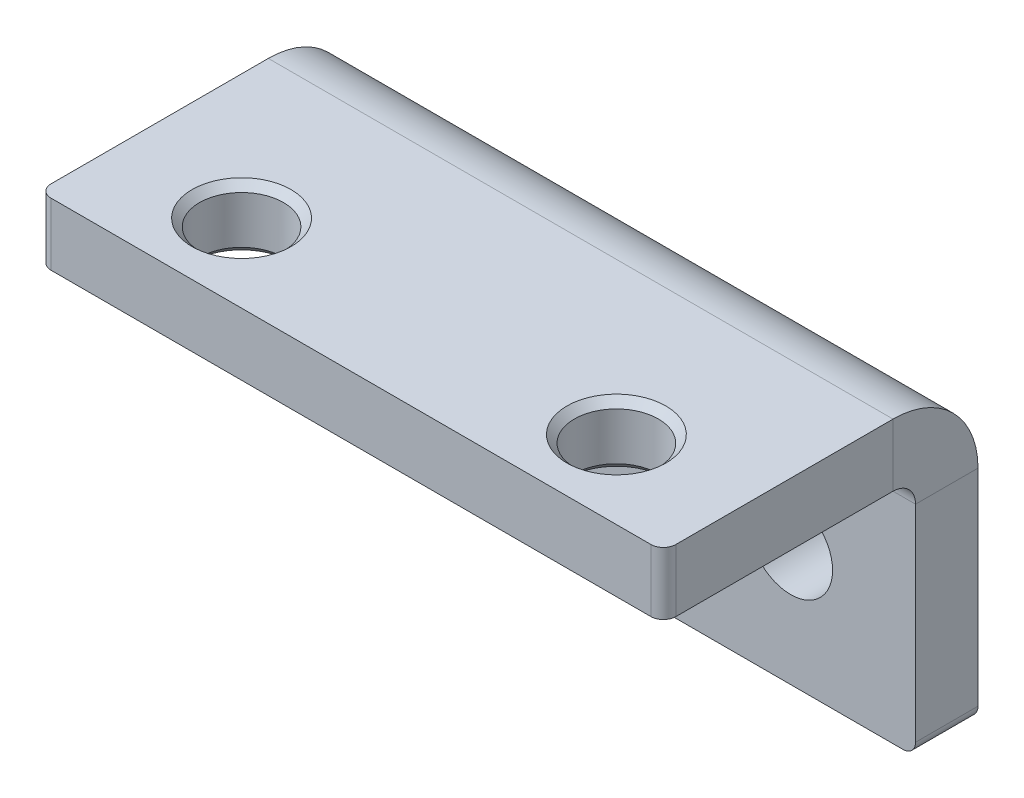
ISO-10303-21;
HEADER;
FILE_DESCRIPTION(('STEP AP214'),'2;1');
FILE_NAME('part.step','',(''),(''),'','','');
FILE_SCHEMA(('AUTOMOTIVE_DESIGN { 1 0 10303 214 1 1 1 1 }'));
ENDSEC;
DATA;
#1=APPLICATION_CONTEXT('core data for automotive mechanical design processes');
#2=APPLICATION_PROTOCOL_DEFINITION('international standard','automotive_design',2000,#1);
#3=PRODUCT_CONTEXT('',#1,'mechanical');
#4=PRODUCT('Part','Part','',(#3));
#5=PRODUCT_RELATED_PRODUCT_CATEGORY('part','',(#4));
#6=PRODUCT_DEFINITION_FORMATION('','',#4);
#7=PRODUCT_DEFINITION_CONTEXT('part definition',#1,'design');
#8=PRODUCT_DEFINITION('design','',#6,#7);
#9=PRODUCT_DEFINITION_SHAPE('','',#8);
#10=(LENGTH_UNIT() NAMED_UNIT(*) SI_UNIT(.MILLI.,.METRE.));
#11=(NAMED_UNIT(*) PLANE_ANGLE_UNIT() SI_UNIT($,.RADIAN.));
#12=(NAMED_UNIT(*) SI_UNIT($,.STERADIAN.) SOLID_ANGLE_UNIT());
#13=UNCERTAINTY_MEASURE_WITH_UNIT(LENGTH_MEASURE(1.E-05),#10,'distance_accuracy_value','');
#14=(GEOMETRIC_REPRESENTATION_CONTEXT(3) GLOBAL_UNCERTAINTY_ASSIGNED_CONTEXT((#13)) GLOBAL_UNIT_ASSIGNED_CONTEXT((#10,
#11,#12)) REPRESENTATION_CONTEXT('',''));
#15=CARTESIAN_POINT('',(0.,0.,0.));
#16=DIRECTION('',(0.,0.,1.));
#17=DIRECTION('',(1.,0.,0.));
#18=AXIS2_PLACEMENT_3D('',#15,#16,#17);
#19=CARTESIAN_POINT('',(15.875,6.16034309821897,15.990143098219));
#20=DIRECTION('',(-1.,0.,0.));
#21=DIRECTION('',(0.,0.,-1.));
#22=AXIS2_PLACEMENT_3D('',#19,#20,#21);
#23=PLANE('',#22);
#24=DIRECTION('',(0.,0.,1.));
#25=VECTOR('',#24,1.);
#26=CARTESIAN_POINT('',(15.875,9.33534309821897,15.990143098219));
#27=LINE('',#26,#25);
#28=CARTESIAN_POINT('',(15.875,9.33534309821901,4.31800000000001));
#29=VERTEX_POINT('',#28);
#30=CARTESIAN_POINT('',(15.875,9.33534309821897,15.355143098219));
#31=VERTEX_POINT('',#30);
#32=EDGE_CURVE('E236',#29,#31,#27,.T.);
#33=ORIENTED_EDGE('',*,*,#32,.T.);
#34=DIRECTION('',(0.,1.,0.));
#35=VECTOR('',#34,1.);
#36=CARTESIAN_POINT('',(15.875,6.16034309821897,15.355143098219));
#37=LINE('',#36,#35);
#38=CARTESIAN_POINT('',(15.875,6.16034309821897,15.355143098219));
#39=VERTEX_POINT('',#38);
#40=EDGE_CURVE('E286',#31,#39,#37,.F.);
#41=ORIENTED_EDGE('',*,*,#40,.T.);
#42=DIRECTION('',(0.,0.,1.));
#43=VECTOR('',#42,1.);
#44=CARTESIAN_POINT('',(15.875,6.16034309821897,15.990143098219));
#45=LINE('',#44,#43);
#46=CARTESIAN_POINT('',(15.875,6.16034309821901,4.318));
#47=VERTEX_POINT('',#46);
#48=EDGE_CURVE('E231',#47,#39,#45,.T.);
#49=ORIENTED_EDGE('',*,*,#48,.F.);
#50=DIRECTION('',(0.,1.,0.));
#51=VECTOR('',#50,1.);
#52=CARTESIAN_POINT('',(15.875,6.16034309821909,4.31799999999999));
#53=LINE('',#52,#51);
#54=EDGE_CURVE('E244',#47,#29,#53,.T.);
#55=ORIENTED_EDGE('',*,*,#54,.T.);
#56=EDGE_LOOP('',(#33,#41,#49,#55));
#57=FACE_BOUND('',#56,.T.);
#58=ADVANCED_FACE('F72',(#57),#23,.F.);
#59=CARTESIAN_POINT('',(-15.875,6.16034309821897,15.990143098219));
#60=DIRECTION('',(1.,0.,0.));
#61=DIRECTION('',(0.,0.,1.));
#62=AXIS2_PLACEMENT_3D('',#59,#60,#61);
#63=PLANE('',#62);
#64=DIRECTION('',(0.,0.,-1.));
#65=VECTOR('',#64,1.);
#66=CARTESIAN_POINT('',(-15.875,6.16034309821897,15.990143098219));
#67=LINE('',#66,#65);
#68=CARTESIAN_POINT('',(-15.875,6.16034309821897,15.355143098219));
#69=VERTEX_POINT('',#68);
#70=CARTESIAN_POINT('',(-15.875,6.160343098219,4.318));
#71=VERTEX_POINT('',#70);
#72=EDGE_CURVE('E235',#69,#71,#67,.T.);
#73=ORIENTED_EDGE('',*,*,#72,.F.);
#74=DIRECTION('',(0.,1.,0.));
#75=VECTOR('',#74,1.);
#76=CARTESIAN_POINT('',(-15.875,6.16034309821897,15.355143098219));
#77=LINE('',#76,#75);
#78=CARTESIAN_POINT('',(-15.875,9.33534309821897,15.355143098219));
#79=VERTEX_POINT('',#78);
#80=EDGE_CURVE('E12',#69,#79,#77,.T.);
#81=ORIENTED_EDGE('',*,*,#80,.T.);
#82=DIRECTION('',(0.,0.,-1.));
#83=VECTOR('',#82,1.);
#84=CARTESIAN_POINT('',(-15.875,9.33534309821897,15.990143098219));
#85=LINE('',#84,#83);
#86=CARTESIAN_POINT('',(-15.875,9.33534309821901,4.31800000000001));
#87=VERTEX_POINT('',#86);
#88=EDGE_CURVE('E209',#79,#87,#85,.T.);
#89=ORIENTED_EDGE('',*,*,#88,.T.);
#90=DIRECTION('',(0.,-1.,0.));
#91=VECTOR('',#90,1.);
#92=CARTESIAN_POINT('',(-15.875,6.16034309821909,4.31799999999999));
#93=LINE('',#92,#91);
#94=EDGE_CURVE('E238',#87,#71,#93,.T.);
#95=ORIENTED_EDGE('',*,*,#94,.T.);
#96=EDGE_LOOP('',(#73,#81,#89,#95));
#97=FACE_BOUND('',#96,.T.);
#98=ADVANCED_FACE('F335',(#97),#63,.F.);
#99=CARTESIAN_POINT('',(0.,9.33534309821904,-4.888656901781));
#100=DIRECTION('',(0.,-1.,0.));
#101=DIRECTION('',(1.,0.,0.));
#102=AXIS2_PLACEMENT_3D('',#99,#100,#101);
#103=PLANE('',#102);
#104=CARTESIAN_POINT('',(9.525,9.33534309821898,12.027743098219));
#105=DIRECTION('',(0.,-1.,0.));
#106=DIRECTION('',(0.,0.,-1.));
#107=AXIS2_PLACEMENT_3D('',#104,#105,#106);
#108=CIRCLE('',#107,2.51459999999999);
#109=CARTESIAN_POINT('',(9.525,9.33534309821899,9.51314309821901));
#110=VERTEX_POINT('',#109);
#111=EDGE_CURVE('E256',#110,#110,#108,.T.);
#112=ORIENTED_EDGE('',*,*,#111,.T.);
#113=EDGE_LOOP('',(#112));
#114=FACE_BOUND('',#113,.T.);
#115=CARTESIAN_POINT('',(-9.525,9.33534309821898,12.027743098219));
#116=DIRECTION('',(0.,-1.,0.));
#117=DIRECTION('',(0.,0.,-1.));
#118=AXIS2_PLACEMENT_3D('',#115,#116,#117);
#119=CIRCLE('',#118,2.51459999999999);
#120=CARTESIAN_POINT('',(-9.525,9.33534309821899,9.51314309821901));
#121=VERTEX_POINT('',#120);
#122=EDGE_CURVE('E247',#121,#121,#119,.T.);
#123=ORIENTED_EDGE('',*,*,#122,.T.);
#124=EDGE_LOOP('',(#123));
#125=FACE_BOUND('',#124,.T.);
#126=DIRECTION('',(-1.,0.,0.));
#127=VECTOR('',#126,1.);
#128=CARTESIAN_POINT('',(-15.875,9.33534309821897,15.990143098219));
#129=LINE('',#128,#127);
#130=CARTESIAN_POINT('',(15.24,9.33534309821897,15.990143098219));
#131=VERTEX_POINT('',#130);
#132=CARTESIAN_POINT('',(-15.24,9.33534309821897,15.990143098219));
#133=VERTEX_POINT('',#132);
#134=EDGE_CURVE('E232',#131,#133,#129,.T.);
#135=ORIENTED_EDGE('',*,*,#134,.F.);
#136=CARTESIAN_POINT('',(15.24,9.33534309821897,15.355143098219));
#137=DIRECTION('',(0.,-1.,0.));
#138=DIRECTION('',(0.,0.,-1.));
#139=AXIS2_PLACEMENT_3D('',#136,#137,#138);
#140=CIRCLE('',#139,0.635);
#141=EDGE_CURVE('E284',#131,#31,#140,.F.);
#142=ORIENTED_EDGE('',*,*,#141,.T.);
#143=ORIENTED_EDGE('',*,*,#32,.F.);
#144=DIRECTION('',(-1.,0.,0.));
#145=VECTOR('',#144,1.);
#146=CARTESIAN_POINT('',(0.,9.33534309821901,4.31800000000003));
#147=LINE('',#146,#145);
#148=EDGE_CURVE('E241',#29,#87,#147,.T.);
#149=ORIENTED_EDGE('',*,*,#148,.T.);
#150=ORIENTED_EDGE('',*,*,#88,.F.);
#151=CARTESIAN_POINT('',(-15.24,9.33534309821897,15.355143098219));
#152=DIRECTION('',(0.,-1.,0.));
#153=DIRECTION('',(0.,0.,-1.));
#154=AXIS2_PLACEMENT_3D('',#151,#152,#153);
#155=CIRCLE('',#154,0.635);
#156=EDGE_CURVE('E282',#79,#133,#155,.F.);
#157=ORIENTED_EDGE('',*,*,#156,.T.);
#158=EDGE_LOOP('',(#135,#142,#143,#149,#150,#157));
#159=FACE_BOUND('',#158,.T.);
#160=ADVANCED_FACE('F332',(#114,#125,#159),#103,.F.);
#161=CARTESIAN_POINT('',(0.,6.16034309821904,-4.88865690178101));
#162=DIRECTION('',(0.,-1.,0.));
#163=DIRECTION('',(1.,0.,0.));
#164=AXIS2_PLACEMENT_3D('',#161,#162,#163);
#165=PLANE('',#164);
#166=CARTESIAN_POINT('',(9.525,6.16034309821898,12.027743098219));
#167=DIRECTION('',(0.,-1.,0.));
#168=DIRECTION('',(0.,0.,-1.));
#169=AXIS2_PLACEMENT_3D('',#166,#167,#168);
#170=CIRCLE('',#169,2.5146);
#171=CARTESIAN_POINT('',(9.525,6.16034309821899,9.51314309821899));
#172=VERTEX_POINT('',#171);
#173=EDGE_CURVE('E268',#172,#172,#170,.F.);
#174=ORIENTED_EDGE('',*,*,#173,.T.);
#175=EDGE_LOOP('',(#174));
#176=FACE_BOUND('',#175,.T.);
#177=CARTESIAN_POINT('',(-9.525,6.16034309821898,12.027743098219));
#178=DIRECTION('',(0.,-1.,0.));
#179=DIRECTION('',(0.,0.,-1.));
#180=AXIS2_PLACEMENT_3D('',#177,#178,#179);
#181=CIRCLE('',#180,2.5146);
#182=CARTESIAN_POINT('',(-9.525,6.16034309821899,9.51314309821899));
#183=VERTEX_POINT('',#182);
#184=EDGE_CURVE('E265',#183,#183,#181,.F.);
#185=ORIENTED_EDGE('',*,*,#184,.T.);
#186=EDGE_LOOP('',(#185));
#187=FACE_BOUND('',#186,.T.);
#188=ORIENTED_EDGE('',*,*,#48,.T.);
#189=CARTESIAN_POINT('',(15.24,6.16034309821897,15.355143098219));
#190=DIRECTION('',(0.,-1.,0.));
#191=DIRECTION('',(0.,0.,-1.));
#192=AXIS2_PLACEMENT_3D('',#189,#190,#191);
#193=CIRCLE('',#192,0.635);
#194=CARTESIAN_POINT('',(15.24,6.16034309821897,15.990143098219));
#195=VERTEX_POINT('',#194);
#196=EDGE_CURVE('E290',#39,#195,#193,.T.);
#197=ORIENTED_EDGE('',*,*,#196,.T.);
#198=DIRECTION('',(-1.,0.,0.));
#199=VECTOR('',#198,1.);
#200=CARTESIAN_POINT('',(-15.875,6.16034309821897,15.990143098219));
#201=LINE('',#200,#199);
#202=CARTESIAN_POINT('',(-15.24,6.16034309821897,15.990143098219));
#203=VERTEX_POINT('',#202);
#204=EDGE_CURVE('E228',#195,#203,#201,.T.);
#205=ORIENTED_EDGE('',*,*,#204,.T.);
#206=CARTESIAN_POINT('',(-15.24,6.16034309821897,15.355143098219));
#207=DIRECTION('',(0.,-1.,0.));
#208=DIRECTION('',(0.,0.,-1.));
#209=AXIS2_PLACEMENT_3D('',#206,#207,#208);
#210=CIRCLE('',#209,0.635);
#211=EDGE_CURVE('E288',#203,#69,#210,.T.);
#212=ORIENTED_EDGE('',*,*,#211,.T.);
#213=ORIENTED_EDGE('',*,*,#72,.T.);
#214=DIRECTION('',(-1.,0.,0.));
#215=VECTOR('',#214,1.);
#216=CARTESIAN_POINT('',(0.,6.16034309821901,4.31799999999999));
#217=LINE('',#216,#215);
#218=EDGE_CURVE('E195',#47,#71,#217,.T.);
#219=ORIENTED_EDGE('',*,*,#218,.F.);
#220=EDGE_LOOP('',(#188,#197,#205,#212,#213,#219));
#221=FACE_BOUND('',#220,.T.);
#222=ADVANCED_FACE('F351',(#176,#187,#221),#165,.T.);
#223=CARTESIAN_POINT('',(-15.875,6.16034309821897,15.990143098219));
#224=DIRECTION('',(0.,0.,-1.));
#225=DIRECTION('',(0.,1.,0.));
#226=AXIS2_PLACEMENT_3D('',#223,#224,#225);
#227=PLANE('',#226);
#228=ORIENTED_EDGE('',*,*,#204,.F.);
#229=DIRECTION('',(0.,1.,0.));
#230=VECTOR('',#229,1.);
#231=CARTESIAN_POINT('',(15.24,6.16034309821897,15.990143098219));
#232=LINE('',#231,#230);
#233=EDGE_CURVE('E279',#195,#131,#232,.T.);
#234=ORIENTED_EDGE('',*,*,#233,.T.);
#235=ORIENTED_EDGE('',*,*,#134,.T.);
#236=DIRECTION('',(0.,1.,0.));
#237=VECTOR('',#236,1.);
#238=CARTESIAN_POINT('',(-15.24,6.16034309821897,15.990143098219));
#239=LINE('',#238,#237);
#240=EDGE_CURVE('E277',#133,#203,#239,.F.);
#241=ORIENTED_EDGE('',*,*,#240,.T.);
#242=EDGE_LOOP('',(#228,#234,#235,#241));
#243=FACE_BOUND('',#242,.T.);
#244=ADVANCED_FACE('F342',(#243),#227,.F.);
#245=CARTESIAN_POINT('',(9.525,6.16034309821898,12.027743098219));
#246=DIRECTION('',(0.,1.,0.));
#247=DIRECTION('',(-1.,0.,0.));
#248=AXIS2_PLACEMENT_3D('',#245,#246,#247);
#249=CYLINDRICAL_SURFACE('',#248,2.1336);
#250=CARTESIAN_POINT('',(9.525,8.95434309821899,12.027743098219));
#251=DIRECTION('',(0.,-1.,0.));
#252=DIRECTION('',(0.,0.,-1.));
#253=AXIS2_PLACEMENT_3D('',#250,#251,#252);
#254=CIRCLE('',#253,2.1336);
#255=CARTESIAN_POINT('',(7.3914,8.95434309821899,12.027743098219));
#256=VERTEX_POINT('',#255);
#257=EDGE_CURVE('E262',#256,#256,#254,.F.);
#258=CARTESIAN_POINT('',(9.525,6.54134309821898,12.027743098219));
#259=DIRECTION('',(0.,-1.,0.));
#260=DIRECTION('',(0.,0.,-1.));
#261=AXIS2_PLACEMENT_3D('',#258,#259,#260);
#262=CIRCLE('',#261,2.1336);
#263=CARTESIAN_POINT('',(7.3914,6.54134309821898,12.027743098219));
#264=VERTEX_POINT('',#263);
#265=EDGE_CURVE('E259',#264,#264,#262,.T.);
#266=CARTESIAN_POINT('',(7.3914,8.95434309821899,12.027743098219));
#267=CARTESIAN_POINT('',(7.3914,8.92920768155233,12.027743098219));
#268=CARTESIAN_POINT('',(7.3914,8.90407226488566,12.027743098219));
#269=CARTESIAN_POINT('',(7.3914,8.85380143155232,12.027743098219));
#270=CARTESIAN_POINT('',(7.3914,8.82866601488566,12.027743098219));
#271=CARTESIAN_POINT('',(7.3914,8.77839518155232,12.027743098219));
#272=CARTESIAN_POINT('',(7.3914,8.75325976488566,12.027743098219));
#273=CARTESIAN_POINT('',(7.3914,8.70298893155232,12.027743098219));
#274=CARTESIAN_POINT('',(7.3914,8.67785351488566,12.027743098219));
#275=CARTESIAN_POINT('',(7.3914,8.62758268155232,12.027743098219));
#276=CARTESIAN_POINT('',(7.3914,8.60244726488566,12.027743098219));
#277=CARTESIAN_POINT('',(7.3914,8.55217643155232,12.027743098219));
#278=CARTESIAN_POINT('',(7.3914,8.52704101488566,12.027743098219));
#279=CARTESIAN_POINT('',(7.3914,8.47677018155232,12.027743098219));
#280=CARTESIAN_POINT('',(7.3914,8.45163476488566,12.027743098219));
#281=CARTESIAN_POINT('',(7.3914,8.40136393155232,12.027743098219));
#282=CARTESIAN_POINT('',(7.3914,8.37622851488566,12.027743098219));
#283=CARTESIAN_POINT('',(7.3914,8.32595768155232,12.027743098219));
#284=CARTESIAN_POINT('',(7.3914,8.30082226488565,12.027743098219));
#285=CARTESIAN_POINT('',(7.3914,8.25055143155232,12.027743098219));
#286=CARTESIAN_POINT('',(7.3914,8.22541601488565,12.027743098219));
#287=CARTESIAN_POINT('',(7.3914,8.17514518155232,12.027743098219));
#288=CARTESIAN_POINT('',(7.3914,8.15000976488565,12.027743098219));
#289=CARTESIAN_POINT('',(7.3914,8.09973893155232,12.027743098219));
#290=CARTESIAN_POINT('',(7.3914,8.07460351488565,12.027743098219));
#291=CARTESIAN_POINT('',(7.3914,8.02433268155232,12.027743098219));
#292=CARTESIAN_POINT('',(7.3914,7.99919726488565,12.027743098219));
#293=CARTESIAN_POINT('',(7.3914,7.94892643155232,12.027743098219));
#294=CARTESIAN_POINT('',(7.3914,7.92379101488565,12.027743098219));
#295=CARTESIAN_POINT('',(7.3914,7.87352018155232,12.027743098219));
#296=CARTESIAN_POINT('',(7.3914,7.84838476488565,12.027743098219));
#297=CARTESIAN_POINT('',(7.3914,7.79811393155232,12.027743098219));
#298=CARTESIAN_POINT('',(7.3914,7.77297851488565,12.027743098219));
#299=CARTESIAN_POINT('',(7.3914,7.72270768155232,12.027743098219));
#300=CARTESIAN_POINT('',(7.3914,7.69757226488565,12.027743098219));
#301=CARTESIAN_POINT('',(7.3914,7.64730143155232,12.027743098219));
#302=CARTESIAN_POINT('',(7.3914,7.62216601488565,12.027743098219));
#303=CARTESIAN_POINT('',(7.3914,7.57189518155232,12.027743098219));
#304=CARTESIAN_POINT('',(7.3914,7.54675976488565,12.027743098219));
#305=CARTESIAN_POINT('',(7.3914,7.49648893155232,12.027743098219));
#306=CARTESIAN_POINT('',(7.3914,7.47135351488565,12.027743098219));
#307=CARTESIAN_POINT('',(7.3914,7.42108268155232,12.027743098219));
#308=CARTESIAN_POINT('',(7.3914,7.39594726488565,12.027743098219));
#309=CARTESIAN_POINT('',(7.3914,7.34567643155232,12.027743098219));
#310=CARTESIAN_POINT('',(7.3914,7.32054101488565,12.027743098219));
#311=CARTESIAN_POINT('',(7.3914,7.27027018155232,12.027743098219));
#312=CARTESIAN_POINT('',(7.3914,7.24513476488565,12.027743098219));
#313=CARTESIAN_POINT('',(7.3914,7.19486393155232,12.027743098219));
#314=CARTESIAN_POINT('',(7.3914,7.16972851488565,12.027743098219));
#315=CARTESIAN_POINT('',(7.3914,7.11945768155232,12.027743098219));
#316=CARTESIAN_POINT('',(7.3914,7.09432226488565,12.027743098219));
#317=CARTESIAN_POINT('',(7.3914,7.04405143155231,12.027743098219));
#318=CARTESIAN_POINT('',(7.3914,7.01891601488565,12.027743098219));
#319=CARTESIAN_POINT('',(7.3914,6.96864518155231,12.027743098219));
#320=CARTESIAN_POINT('',(7.3914,6.94350976488565,12.027743098219));
#321=CARTESIAN_POINT('',(7.3914,6.89323893155231,12.027743098219));
#322=CARTESIAN_POINT('',(7.3914,6.86810351488565,12.027743098219));
#323=CARTESIAN_POINT('',(7.3914,6.81783268155231,12.027743098219));
#324=CARTESIAN_POINT('',(7.3914,6.79269726488565,12.027743098219));
#325=CARTESIAN_POINT('',(7.3914,6.74242643155231,12.027743098219));
#326=CARTESIAN_POINT('',(7.3914,6.71729101488565,12.027743098219));
#327=CARTESIAN_POINT('',(7.3914,6.66702018155231,12.027743098219));
#328=CARTESIAN_POINT('',(7.3914,6.64188476488565,12.027743098219));
#329=CARTESIAN_POINT('',(7.3914,6.59161393155231,12.027743098219));
#330=CARTESIAN_POINT('',(7.3914,6.56647851488565,12.027743098219));
#331=CARTESIAN_POINT('',(7.3914,6.54134309821898,12.027743098219));
#332=B_SPLINE_CURVE_WITH_KNOTS('',3,(#266,#267,#268,#269,#270,#271,#272,#273,#274,#275,#276,
#277,#278,#279,#280,#281,#282,#283,#284,#285,#286,#287,#288,#289,#290,#291,#292,#293,#294,#295,
#296,#297,#298,#299,#300,#301,#302,#303,#304,#305,#306,#307,#308,#309,#310,#311,#312,#313,#314,
#315,#316,#317,#318,#319,#320,#321,#322,#323,#324,#325,#326,#327,#328,#329,#330,#331),
.UNSPECIFIED.,.F.,.F.,(4,2,2,2,2,2,2,2,2,2,2,2,2,2,2,2,2,2,2,2,2,2,2,2,2,2,2,2,2,2,2,2,4),(0.,
0.0754062500000017,0.150812500000002,0.226218750000002,0.301625000000003,0.377031250000003,
0.452437500000003,0.527843750000003,0.603250000000003,0.678656250000005,0.754062500000005,
0.829468750000005,0.904875000000005,0.980281250000006,1.05568750000001,1.13109375000001,
1.20650000000001,1.28190625000001,1.35731250000001,1.43271875000001,1.50812500000001,
1.58353125000001,1.65893750000001,1.73434375000001,1.80975000000001,1.88515625000001,
1.96056250000001,2.03596875000001,2.11137500000001,2.18678125000001,2.26218750000001,
2.33759375000001,2.41300000000001),.UNSPECIFIED.);
#333=EDGE_CURVE('BSEAM359',#256,#264,#332,.T.);
#334=ORIENTED_EDGE('',*,*,#257,.T.);
#335=ORIENTED_EDGE('',*,*,#265,.T.);
#336=ORIENTED_EDGE('',*,*,#333,.T.);
#337=ORIENTED_EDGE('',*,*,#333,.F.);
#338=EDGE_LOOP('',(#334,#336,#335,#337));
#339=FACE_BOUND('',#338,.T.);
#340=ADVANCED_FACE('F359',(#339),#249,.F.);
#341=CARTESIAN_POINT('',(-9.525,6.16034309821898,12.027743098219));
#342=DIRECTION('',(0.,1.,0.));
#343=DIRECTION('',(-1.,0.,0.));
#344=AXIS2_PLACEMENT_3D('',#341,#342,#343);
#345=CYLINDRICAL_SURFACE('',#344,2.1336);
#346=CARTESIAN_POINT('',(-9.525,8.95434309821899,12.027743098219));
#347=DIRECTION('',(0.,-1.,0.));
#348=DIRECTION('',(0.,0.,-1.));
#349=AXIS2_PLACEMENT_3D('',#346,#347,#348);
#350=CIRCLE('',#349,2.1336);
#351=CARTESIAN_POINT('',(-11.6586,8.95434309821899,12.027743098219));
#352=VERTEX_POINT('',#351);
#353=EDGE_CURVE('E274',#352,#352,#350,.F.);
#354=CARTESIAN_POINT('',(-9.525,6.54134309821898,12.027743098219));
#355=DIRECTION('',(0.,-1.,0.));
#356=DIRECTION('',(0.,0.,-1.));
#357=AXIS2_PLACEMENT_3D('',#354,#355,#356);
#358=CIRCLE('',#357,2.1336);
#359=CARTESIAN_POINT('',(-11.6586,6.54134309821898,12.027743098219));
#360=VERTEX_POINT('',#359);
#361=EDGE_CURVE('E271',#360,#360,#358,.T.);
#362=CARTESIAN_POINT('',(-11.6586,8.95434309821899,12.027743098219));
#363=CARTESIAN_POINT('',(-11.6586,8.92920768155233,12.027743098219));
#364=CARTESIAN_POINT('',(-11.6586,8.90407226488566,12.027743098219));
#365=CARTESIAN_POINT('',(-11.6586,8.85380143155232,12.027743098219));
#366=CARTESIAN_POINT('',(-11.6586,8.82866601488566,12.027743098219));
#367=CARTESIAN_POINT('',(-11.6586,8.77839518155232,12.027743098219));
#368=CARTESIAN_POINT('',(-11.6586,8.75325976488566,12.027743098219));
#369=CARTESIAN_POINT('',(-11.6586,8.70298893155232,12.027743098219));
#370=CARTESIAN_POINT('',(-11.6586,8.67785351488566,12.027743098219));
#371=CARTESIAN_POINT('',(-11.6586,8.62758268155232,12.027743098219));
#372=CARTESIAN_POINT('',(-11.6586,8.60244726488566,12.027743098219));
#373=CARTESIAN_POINT('',(-11.6586,8.55217643155232,12.027743098219));
#374=CARTESIAN_POINT('',(-11.6586,8.52704101488566,12.027743098219));
#375=CARTESIAN_POINT('',(-11.6586,8.47677018155232,12.027743098219));
#376=CARTESIAN_POINT('',(-11.6586,8.45163476488566,12.027743098219));
#377=CARTESIAN_POINT('',(-11.6586,8.40136393155232,12.027743098219));
#378=CARTESIAN_POINT('',(-11.6586,8.37622851488566,12.027743098219));
#379=CARTESIAN_POINT('',(-11.6586,8.32595768155232,12.027743098219));
#380=CARTESIAN_POINT('',(-11.6586,8.30082226488565,12.027743098219));
#381=CARTESIAN_POINT('',(-11.6586,8.25055143155232,12.027743098219));
#382=CARTESIAN_POINT('',(-11.6586,8.22541601488565,12.027743098219));
#383=CARTESIAN_POINT('',(-11.6586,8.17514518155232,12.027743098219));
#384=CARTESIAN_POINT('',(-11.6586,8.15000976488565,12.027743098219));
#385=CARTESIAN_POINT('',(-11.6586,8.09973893155232,12.027743098219));
#386=CARTESIAN_POINT('',(-11.6586,8.07460351488565,12.027743098219));
#387=CARTESIAN_POINT('',(-11.6586,8.02433268155232,12.027743098219));
#388=CARTESIAN_POINT('',(-11.6586,7.99919726488565,12.027743098219));
#389=CARTESIAN_POINT('',(-11.6586,7.94892643155232,12.027743098219));
#390=CARTESIAN_POINT('',(-11.6586,7.92379101488565,12.027743098219));
#391=CARTESIAN_POINT('',(-11.6586,7.87352018155232,12.027743098219));
#392=CARTESIAN_POINT('',(-11.6586,7.84838476488565,12.027743098219));
#393=CARTESIAN_POINT('',(-11.6586,7.79811393155232,12.027743098219));
#394=CARTESIAN_POINT('',(-11.6586,7.77297851488565,12.027743098219));
#395=CARTESIAN_POINT('',(-11.6586,7.72270768155232,12.027743098219));
#396=CARTESIAN_POINT('',(-11.6586,7.69757226488565,12.027743098219));
#397=CARTESIAN_POINT('',(-11.6586,7.64730143155232,12.027743098219));
#398=CARTESIAN_POINT('',(-11.6586,7.62216601488565,12.027743098219));
#399=CARTESIAN_POINT('',(-11.6586,7.57189518155232,12.027743098219));
#400=CARTESIAN_POINT('',(-11.6586,7.54675976488565,12.027743098219));
#401=CARTESIAN_POINT('',(-11.6586,7.49648893155232,12.027743098219));
#402=CARTESIAN_POINT('',(-11.6586,7.47135351488565,12.027743098219));
#403=CARTESIAN_POINT('',(-11.6586,7.42108268155232,12.027743098219));
#404=CARTESIAN_POINT('',(-11.6586,7.39594726488565,12.027743098219));
#405=CARTESIAN_POINT('',(-11.6586,7.34567643155232,12.027743098219));
#406=CARTESIAN_POINT('',(-11.6586,7.32054101488565,12.027743098219));
#407=CARTESIAN_POINT('',(-11.6586,7.27027018155232,12.027743098219));
#408=CARTESIAN_POINT('',(-11.6586,7.24513476488565,12.027743098219));
#409=CARTESIAN_POINT('',(-11.6586,7.19486393155232,12.027743098219));
#410=CARTESIAN_POINT('',(-11.6586,7.16972851488565,12.027743098219));
#411=CARTESIAN_POINT('',(-11.6586,7.11945768155232,12.027743098219));
#412=CARTESIAN_POINT('',(-11.6586,7.09432226488565,12.027743098219));
#413=CARTESIAN_POINT('',(-11.6586,7.04405143155231,12.027743098219));
#414=CARTESIAN_POINT('',(-11.6586,7.01891601488565,12.027743098219));
#415=CARTESIAN_POINT('',(-11.6586,6.96864518155231,12.027743098219));
#416=CARTESIAN_POINT('',(-11.6586,6.94350976488565,12.027743098219));
#417=CARTESIAN_POINT('',(-11.6586,6.89323893155231,12.027743098219));
#418=CARTESIAN_POINT('',(-11.6586,6.86810351488565,12.027743098219));
#419=CARTESIAN_POINT('',(-11.6586,6.81783268155231,12.027743098219));
#420=CARTESIAN_POINT('',(-11.6586,6.79269726488565,12.027743098219));
#421=CARTESIAN_POINT('',(-11.6586,6.74242643155231,12.027743098219));
#422=CARTESIAN_POINT('',(-11.6586,6.71729101488565,12.027743098219));
#423=CARTESIAN_POINT('',(-11.6586,6.66702018155231,12.027743098219));
#424=CARTESIAN_POINT('',(-11.6586,6.64188476488565,12.027743098219));
#425=CARTESIAN_POINT('',(-11.6586,6.59161393155231,12.027743098219));
#426=CARTESIAN_POINT('',(-11.6586,6.56647851488565,12.027743098219));
#427=CARTESIAN_POINT('',(-11.6586,6.54134309821898,12.027743098219));
#428=B_SPLINE_CURVE_WITH_KNOTS('',3,(#362,#363,#364,#365,#366,#367,#368,#369,#370,#371,#372,
#373,#374,#375,#376,#377,#378,#379,#380,#381,#382,#383,#384,#385,#386,#387,#388,#389,#390,#391,
#392,#393,#394,#395,#396,#397,#398,#399,#400,#401,#402,#403,#404,#405,#406,#407,#408,#409,#410,
#411,#412,#413,#414,#415,#416,#417,#418,#419,#420,#421,#422,#423,#424,#425,#426,#427),
.UNSPECIFIED.,.F.,.F.,(4,2,2,2,2,2,2,2,2,2,2,2,2,2,2,2,2,2,2,2,2,2,2,2,2,2,2,2,2,2,2,2,4),(0.,
0.0754062500000017,0.150812500000002,0.226218750000002,0.301625000000003,0.377031250000003,
0.452437500000003,0.527843750000003,0.603250000000003,0.678656250000005,0.754062500000005,
0.829468750000005,0.904875000000005,0.980281250000006,1.05568750000001,1.13109375000001,
1.20650000000001,1.28190625000001,1.35731250000001,1.43271875000001,1.50812500000001,
1.58353125000001,1.65893750000001,1.73434375000001,1.80975000000001,1.88515625000001,
1.96056250000001,2.03596875000001,2.11137500000001,2.18678125000001,2.26218750000001,
2.33759375000001,2.41300000000001),.UNSPECIFIED.);
#429=EDGE_CURVE('BSEAM465',#352,#360,#428,.T.);
#430=ORIENTED_EDGE('',*,*,#353,.T.);
#431=ORIENTED_EDGE('',*,*,#361,.T.);
#432=ORIENTED_EDGE('',*,*,#429,.T.);
#433=ORIENTED_EDGE('',*,*,#429,.F.);
#434=EDGE_LOOP('',(#430,#432,#431,#433));
#435=FACE_BOUND('',#434,.T.);
#436=ADVANCED_FACE('F465',(#435),#345,.F.);
#437=CARTESIAN_POINT('',(-15.875,-6.096,3.175));
#438=DIRECTION('',(0.,1.,0.));
#439=DIRECTION('',(0.,0.,1.));
#440=AXIS2_PLACEMENT_3D('',#437,#438,#439);
#441=PLANE('',#440);
#442=DIRECTION('',(1.,0.,0.));
#443=VECTOR('',#442,1.);
#444=CARTESIAN_POINT('',(-15.875,-6.096,0.));
#445=LINE('',#444,#443);
#446=CARTESIAN_POINT('',(-15.24,-6.096,0.));
#447=VERTEX_POINT('',#446);
#448=CARTESIAN_POINT('',(15.24,-6.096,0.));
#449=VERTEX_POINT('',#448);
#450=EDGE_CURVE('E190',#447,#449,#445,.T.);
#451=ORIENTED_EDGE('',*,*,#450,.T.);
#452=DIRECTION('',(0.,0.,-1.));
#453=VECTOR('',#452,1.);
#454=CARTESIAN_POINT('',(15.24,-6.096,3.175));
#455=LINE('',#454,#453);
#456=CARTESIAN_POINT('',(15.24,-6.096,3.175));
#457=VERTEX_POINT('',#456);
#458=EDGE_CURVE('E94',#449,#457,#455,.F.);
#459=ORIENTED_EDGE('',*,*,#458,.T.);
#460=DIRECTION('',(1.,0.,0.));
#461=VECTOR('',#460,1.);
#462=CARTESIAN_POINT('',(-15.875,-6.096,3.175));
#463=LINE('',#462,#461);
#464=CARTESIAN_POINT('',(-15.24,-6.096,3.175));
#465=VERTEX_POINT('',#464);
#466=EDGE_CURVE('E169',#465,#457,#463,.T.);
#467=ORIENTED_EDGE('',*,*,#466,.F.);
#468=DIRECTION('',(0.,0.,-1.));
#469=VECTOR('',#468,1.);
#470=CARTESIAN_POINT('',(-15.24,-6.096,3.175));
#471=LINE('',#470,#469);
#472=EDGE_CURVE('E299',#465,#447,#471,.T.);
#473=ORIENTED_EDGE('',*,*,#472,.T.);
#474=EDGE_LOOP('',(#451,#459,#467,#473));
#475=FACE_BOUND('',#474,.T.);
#476=ADVANCED_FACE('F318',(#475),#441,.F.);
#477=CARTESIAN_POINT('',(-9.525,0.,3.175));
#478=DIRECTION('',(0.,0.,-1.));
#479=DIRECTION('',(-1.,0.,0.));
#480=AXIS2_PLACEMENT_3D('',#477,#478,#479);
#481=CYLINDRICAL_SURFACE('',#480,2.1336);
#482=CARTESIAN_POINT('',(-9.525,0.,3.175));
#483=DIRECTION('',(0.,0.,1.));
#484=DIRECTION('',(1.,0.,0.));
#485=AXIS2_PLACEMENT_3D('',#482,#483,#484);
#486=CIRCLE('',#485,2.1336);
#487=CARTESIAN_POINT('',(-7.3914,0.,3.175));
#488=VERTEX_POINT('',#487);
#489=EDGE_CURVE('E223',#488,#488,#486,.T.);
#490=ORIENTED_EDGE('',*,*,#489,.T.);
#491=EDGE_LOOP('',(#490));
#492=FACE_BOUND('',#491,.T.);
#493=CARTESIAN_POINT('',(-9.525,0.,0.));
#494=DIRECTION('',(0.,0.,1.));
#495=DIRECTION('',(1.,0.,0.));
#496=AXIS2_PLACEMENT_3D('',#493,#494,#495);
#497=CIRCLE('',#496,2.1336);
#498=CARTESIAN_POINT('',(-7.3914,0.,0.));
#499=VERTEX_POINT('',#498);
#500=EDGE_CURVE('E210',#499,#499,#497,.T.);
#501=ORIENTED_EDGE('',*,*,#500,.F.);
#502=EDGE_LOOP('',(#501));
#503=FACE_BOUND('',#502,.T.);
#504=ADVANCED_FACE('F464',(#492,#503),#481,.F.);
#505=CARTESIAN_POINT('',(9.525,0.,3.175));
#506=DIRECTION('',(0.,0.,-1.));
#507=DIRECTION('',(-1.,0.,0.));
#508=AXIS2_PLACEMENT_3D('',#505,#506,#507);
#509=CYLINDRICAL_SURFACE('',#508,2.1336);
#510=CARTESIAN_POINT('',(9.525,0.,3.175));
#511=DIRECTION('',(0.,0.,1.));
#512=DIRECTION('',(1.,0.,0.));
#513=AXIS2_PLACEMENT_3D('',#510,#511,#512);
#514=CIRCLE('',#513,2.1336);
#515=CARTESIAN_POINT('',(11.6586,0.,3.175));
#516=VERTEX_POINT('',#515);
#517=EDGE_CURVE('E220',#516,#516,#514,.T.);
#518=ORIENTED_EDGE('',*,*,#517,.T.);
#519=EDGE_LOOP('',(#518));
#520=FACE_BOUND('',#519,.T.);
#521=CARTESIAN_POINT('',(9.525,0.,0.));
#522=DIRECTION('',(0.,0.,1.));
#523=DIRECTION('',(1.,0.,0.));
#524=AXIS2_PLACEMENT_3D('',#521,#522,#523);
#525=CIRCLE('',#524,2.1336);
#526=CARTESIAN_POINT('',(11.6586,0.,0.));
#527=VERTEX_POINT('',#526);
#528=EDGE_CURVE('E213',#527,#527,#525,.T.);
#529=ORIENTED_EDGE('',*,*,#528,.F.);
#530=EDGE_LOOP('',(#529));
#531=FACE_BOUND('',#530,.T.);
#532=ADVANCED_FACE('F451',(#520,#531),#509,.F.);
#533=CARTESIAN_POINT('',(0.,0.,3.175));
#534=DIRECTION('',(0.,0.,1.));
#535=DIRECTION('',(1.,0.,0.));
#536=AXIS2_PLACEMENT_3D('',#533,#534,#535);
#537=PLANE('',#536);
#538=ORIENTED_EDGE('',*,*,#517,.F.);
#539=EDGE_LOOP('',(#538));
#540=FACE_BOUND('',#539,.T.);
#541=ORIENTED_EDGE('',*,*,#489,.F.);
#542=EDGE_LOOP('',(#541));
#543=FACE_BOUND('',#542,.T.);
#544=ORIENTED_EDGE('',*,*,#466,.T.);
#545=CARTESIAN_POINT('',(15.24,-5.461,3.175));
#546=DIRECTION('',(0.,0.,1.));
#547=DIRECTION('',(1.,0.,0.));
#548=AXIS2_PLACEMENT_3D('',#545,#546,#547);
#549=CIRCLE('',#548,0.635);
#550=CARTESIAN_POINT('',(15.875,-5.461,3.175));
#551=VERTEX_POINT('',#550);
#552=EDGE_CURVE('E305',#457,#551,#549,.T.);
#553=ORIENTED_EDGE('',*,*,#552,.T.);
#554=DIRECTION('',(0.,1.,0.));
#555=VECTOR('',#554,1.);
#556=CARTESIAN_POINT('',(15.875,20.8788,3.175));
#557=LINE('',#556,#555);
#558=CARTESIAN_POINT('',(15.875,5.01734309821901,3.175));
#559=VERTEX_POINT('',#558);
#560=EDGE_CURVE('E175',#551,#559,#557,.T.);
#561=ORIENTED_EDGE('',*,*,#560,.T.);
#562=DIRECTION('',(-1.,0.,0.));
#563=VECTOR('',#562,1.);
#564=CARTESIAN_POINT('',(0.,5.017343098219,3.175));
#565=LINE('',#564,#563);
#566=CARTESIAN_POINT('',(-15.875,5.01734309821901,3.175));
#567=VERTEX_POINT('',#566);
#568=EDGE_CURVE('E170',#559,#567,#565,.T.);
#569=ORIENTED_EDGE('',*,*,#568,.T.);
#570=DIRECTION('',(0.,-1.,0.));
#571=VECTOR('',#570,1.);
#572=CARTESIAN_POINT('',(-15.875,20.8788,3.175));
#573=LINE('',#572,#571);
#574=CARTESIAN_POINT('',(-15.875,-5.461,3.175));
#575=VERTEX_POINT('',#574);
#576=EDGE_CURVE('E161',#567,#575,#573,.T.);
#577=ORIENTED_EDGE('',*,*,#576,.T.);
#578=CARTESIAN_POINT('',(-15.24,-5.461,3.175));
#579=DIRECTION('',(0.,0.,1.));
#580=DIRECTION('',(1.,0.,0.));
#581=AXIS2_PLACEMENT_3D('',#578,#579,#580);
#582=CIRCLE('',#581,0.635);
#583=EDGE_CURVE('E303',#575,#465,#582,.T.);
#584=ORIENTED_EDGE('',*,*,#583,.T.);
#585=EDGE_LOOP('',(#544,#553,#561,#569,#577,#584));
#586=FACE_BOUND('',#585,.T.);
#587=ADVANCED_FACE('F173',(#540,#543,#586),#537,.T.);
#588=CARTESIAN_POINT('',(-15.875,20.8788,3.175));
#589=DIRECTION('',(1.,0.,0.));
#590=DIRECTION('',(0.,1.,0.));
#591=AXIS2_PLACEMENT_3D('',#588,#589,#590);
#592=PLANE('',#591);
#593=DIRECTION('',(0.,-1.,0.));
#594=VECTOR('',#593,1.);
#595=CARTESIAN_POINT('',(-15.875,20.8788,0.));
#596=LINE('',#595,#594);
#597=CARTESIAN_POINT('',(-15.875,5.01734309821901,0.));
#598=VERTEX_POINT('',#597);
#599=CARTESIAN_POINT('',(-15.875,-5.461,0.));
#600=VERTEX_POINT('',#599);
#601=EDGE_CURVE('E216',#598,#600,#596,.T.);
#602=ORIENTED_EDGE('',*,*,#601,.T.);
#603=DIRECTION('',(0.,0.,-1.));
#604=VECTOR('',#603,1.);
#605=CARTESIAN_POINT('',(-15.875,-5.461,3.175));
#606=LINE('',#605,#604);
#607=EDGE_CURVE('E80',#600,#575,#606,.F.);
#608=ORIENTED_EDGE('',*,*,#607,.T.);
#609=ORIENTED_EDGE('',*,*,#576,.F.);
#610=DIRECTION('',(0.,0.,1.));
#611=VECTOR('',#610,1.);
#612=CARTESIAN_POINT('',(-15.875,5.017343098219,3.17499999999989));
#613=LINE('',#612,#611);
#614=EDGE_CURVE('E165',#598,#567,#613,.T.);
#615=ORIENTED_EDGE('',*,*,#614,.F.);
#616=EDGE_LOOP('',(#602,#608,#609,#615));
#617=FACE_BOUND('',#616,.T.);
#618=ADVANCED_FACE('F163',(#617),#592,.F.);
#619=CARTESIAN_POINT('',(0.,0.,0.));
#620=DIRECTION('',(0.,0.,1.));
#621=DIRECTION('',(1.,0.,0.));
#622=AXIS2_PLACEMENT_3D('',#619,#620,#621);
#623=PLANE('',#622);
#624=DIRECTION('',(0.,1.,0.));
#625=VECTOR('',#624,1.);
#626=CARTESIAN_POINT('',(15.875,20.8788,0.));
#627=LINE('',#626,#625);
#628=CARTESIAN_POINT('',(15.875,-5.461,0.));
#629=VERTEX_POINT('',#628);
#630=CARTESIAN_POINT('',(15.875,5.01734309821901,0.));
#631=VERTEX_POINT('',#630);
#632=EDGE_CURVE('E207',#629,#631,#627,.T.);
#633=ORIENTED_EDGE('',*,*,#632,.F.);
#634=CARTESIAN_POINT('',(15.24,-5.461,0.));
#635=DIRECTION('',(0.,0.,1.));
#636=DIRECTION('',(1.,0.,0.));
#637=AXIS2_PLACEMENT_3D('',#634,#635,#636);
#638=CIRCLE('',#637,0.635);
#639=EDGE_CURVE('E297',#629,#449,#638,.F.);
#640=ORIENTED_EDGE('',*,*,#639,.T.);
#641=ORIENTED_EDGE('',*,*,#450,.F.);
#642=CARTESIAN_POINT('',(-15.24,-5.461,0.));
#643=DIRECTION('',(0.,0.,1.));
#644=DIRECTION('',(1.,0.,0.));
#645=AXIS2_PLACEMENT_3D('',#642,#643,#644);
#646=CIRCLE('',#645,0.635);
#647=EDGE_CURVE('E295',#447,#600,#646,.F.);
#648=ORIENTED_EDGE('',*,*,#647,.T.);
#649=ORIENTED_EDGE('',*,*,#601,.F.);
#650=DIRECTION('',(-1.,0.,0.));
#651=VECTOR('',#650,1.);
#652=CARTESIAN_POINT('',(0.,5.01734309821902,0.));
#653=LINE('',#652,#651);
#654=EDGE_CURVE('E191',#631,#598,#653,.T.);
#655=ORIENTED_EDGE('',*,*,#654,.F.);
#656=EDGE_LOOP('',(#633,#640,#641,#648,#649,#655));
#657=FACE_BOUND('',#656,.T.);
#658=ORIENTED_EDGE('',*,*,#528,.T.);
#659=EDGE_LOOP('',(#658));
#660=FACE_BOUND('',#659,.T.);
#661=ORIENTED_EDGE('',*,*,#500,.T.);
#662=EDGE_LOOP('',(#661));
#663=FACE_BOUND('',#662,.T.);
#664=ADVANCED_FACE('F315',(#657,#660,#663),#623,.F.);
#665=CARTESIAN_POINT('',(15.875,20.8788,3.175));
#666=DIRECTION('',(-1.,0.,0.));
#667=DIRECTION('',(0.,-1.,0.));
#668=AXIS2_PLACEMENT_3D('',#665,#666,#667);
#669=PLANE('',#668);
#670=ORIENTED_EDGE('',*,*,#560,.F.);
#671=DIRECTION('',(0.,0.,-1.));
#672=VECTOR('',#671,1.);
#673=CARTESIAN_POINT('',(15.875,-5.461,3.175));
#674=LINE('',#673,#672);
#675=EDGE_CURVE('E292',#551,#629,#674,.T.);
#676=ORIENTED_EDGE('',*,*,#675,.T.);
#677=ORIENTED_EDGE('',*,*,#632,.T.);
#678=DIRECTION('',(0.,0.,-1.));
#679=VECTOR('',#678,1.);
#680=CARTESIAN_POINT('',(15.875,5.017343098219,3.17499999999989));
#681=LINE('',#680,#679);
#682=EDGE_CURVE('E196',#559,#631,#681,.T.);
#683=ORIENTED_EDGE('',*,*,#682,.F.);
#684=EDGE_LOOP('',(#670,#676,#677,#683));
#685=FACE_BOUND('',#684,.T.);
#686=ADVANCED_FACE('F310',(#685),#669,.F.);
#687=CARTESIAN_POINT('',(15.875,5.017343098219,4.318));
#688=DIRECTION('',(-1.,0.,0.));
#689=DIRECTION('',(0.,0.,1.));
#690=AXIS2_PLACEMENT_3D('',#687,#688,#689);
#691=PLANE('',#690);
#692=ORIENTED_EDGE('',*,*,#682,.T.);
#693=CARTESIAN_POINT('',(15.875,5.017343098219,4.318));
#694=DIRECTION('',(-1.,0.,0.));
#695=DIRECTION('',(0.,0.,1.));
#696=AXIS2_PLACEMENT_3D('',#693,#694,#695);
#697=CIRCLE('',#696,4.318);
#698=EDGE_CURVE('E203',#631,#29,#697,.F.);
#699=ORIENTED_EDGE('',*,*,#698,.T.);
#700=ORIENTED_EDGE('',*,*,#54,.F.);
#701=CARTESIAN_POINT('',(15.875,5.017343098219,4.318));
#702=DIRECTION('',(1.,0.,0.));
#703=DIRECTION('',(0.,0.,-1.));
#704=AXIS2_PLACEMENT_3D('',#701,#702,#703);
#705=CIRCLE('',#704,1.143);
#706=EDGE_CURVE('E197',#559,#47,#705,.T.);
#707=ORIENTED_EDGE('',*,*,#706,.F.);
#708=EDGE_LOOP('',(#692,#699,#700,#707));
#709=FACE_BOUND('',#708,.T.);
#710=ADVANCED_FACE('F325',(#709),#691,.F.);
#711=CARTESIAN_POINT('',(-15.875,5.017343098219,4.318));
#712=DIRECTION('',(1.,0.,0.));
#713=DIRECTION('',(0.,0.,-1.));
#714=AXIS2_PLACEMENT_3D('',#711,#712,#713);
#715=PLANE('',#714);
#716=CARTESIAN_POINT('',(-15.875,5.017343098219,4.318));
#717=DIRECTION('',(-1.,0.,0.));
#718=DIRECTION('',(0.,0.,1.));
#719=AXIS2_PLACEMENT_3D('',#716,#717,#718);
#720=CIRCLE('',#719,4.318);
#721=EDGE_CURVE('E189',#87,#598,#720,.T.);
#722=ORIENTED_EDGE('',*,*,#721,.T.);
#723=ORIENTED_EDGE('',*,*,#614,.T.);
#724=CARTESIAN_POINT('',(-15.875,5.017343098219,4.318));
#725=DIRECTION('',(-1.,0.,0.));
#726=DIRECTION('',(0.,0.,1.));
#727=AXIS2_PLACEMENT_3D('',#724,#725,#726);
#728=CIRCLE('',#727,1.143);
#729=EDGE_CURVE('E187',#71,#567,#728,.T.);
#730=ORIENTED_EDGE('',*,*,#729,.F.);
#731=ORIENTED_EDGE('',*,*,#94,.F.);
#732=EDGE_LOOP('',(#722,#723,#730,#731));
#733=FACE_BOUND('',#732,.T.);
#734=ADVANCED_FACE('F185',(#733),#715,.F.);
#735=CARTESIAN_POINT('',(32.1821918946599,5.017343098219,4.318));
#736=DIRECTION('',(-1.,0.,0.));
#737=DIRECTION('',(0.,0.,1.));
#738=AXIS2_PLACEMENT_3D('',#735,#736,#737);
#739=CYLINDRICAL_SURFACE('',#738,1.143);
#740=ORIENTED_EDGE('',*,*,#218,.T.);
#741=ORIENTED_EDGE('',*,*,#729,.T.);
#742=ORIENTED_EDGE('',*,*,#568,.F.);
#743=ORIENTED_EDGE('',*,*,#706,.T.);
#744=EDGE_LOOP('',(#740,#741,#742,#743));
#745=FACE_BOUND('',#744,.T.);
#746=ADVANCED_FACE('F194',(#745),#739,.F.);
#747=CARTESIAN_POINT('',(32.1821918946599,5.017343098219,4.318));
#748=DIRECTION('',(-1.,0.,0.));
#749=DIRECTION('',(0.,0.,1.));
#750=AXIS2_PLACEMENT_3D('',#747,#748,#749);
#751=CYLINDRICAL_SURFACE('',#750,4.318);
#752=ORIENTED_EDGE('',*,*,#148,.F.);
#753=ORIENTED_EDGE('',*,*,#698,.F.);
#754=ORIENTED_EDGE('',*,*,#654,.T.);
#755=ORIENTED_EDGE('',*,*,#721,.F.);
#756=EDGE_LOOP('',(#752,#753,#754,#755));
#757=FACE_BOUND('',#756,.T.);
#758=ADVANCED_FACE('F328',(#757),#751,.T.);
#759=CARTESIAN_POINT('',(9.525,9.33534309821898,12.027743098219));
#760=DIRECTION('',(0.,1.,0.));
#761=DIRECTION('',(0.,0.,1.));
#762=AXIS2_PLACEMENT_3D('',#759,#760,#761);
#763=CONICAL_SURFACE('',#762,2.51459999999999,0.785398163397442);
#764=ORIENTED_EDGE('',*,*,#257,.F.);
#765=EDGE_LOOP('',(#764));
#766=FACE_BOUND('',#765,.T.);
#767=ORIENTED_EDGE('',*,*,#111,.F.);
#768=EDGE_LOOP('',(#767));
#769=FACE_BOUND('',#768,.T.);
#770=ADVANCED_FACE('F371',(#766,#769),#763,.F.);
#771=CARTESIAN_POINT('',(9.525,6.54134309821898,12.027743098219));
#772=DIRECTION('',(0.,-1.,0.));
#773=DIRECTION('',(0.,0.,-1.));
#774=AXIS2_PLACEMENT_3D('',#771,#772,#773);
#775=CONICAL_SURFACE('',#774,2.1336,0.785398163397455);
#776=ORIENTED_EDGE('',*,*,#173,.F.);
#777=EDGE_LOOP('',(#776));
#778=FACE_BOUND('',#777,.T.);
#779=ORIENTED_EDGE('',*,*,#265,.F.);
#780=EDGE_LOOP('',(#779));
#781=FACE_BOUND('',#780,.T.);
#782=ADVANCED_FACE('F374',(#778,#781),#775,.F.);
#783=CARTESIAN_POINT('',(-9.525,9.33534309821898,12.027743098219));
#784=DIRECTION('',(0.,1.,0.));
#785=DIRECTION('',(0.,0.,1.));
#786=AXIS2_PLACEMENT_3D('',#783,#784,#785);
#787=CONICAL_SURFACE('',#786,2.51459999999999,0.785398163397442);
#788=ORIENTED_EDGE('',*,*,#353,.F.);
#789=EDGE_LOOP('',(#788));
#790=FACE_BOUND('',#789,.T.);
#791=ORIENTED_EDGE('',*,*,#122,.F.);
#792=EDGE_LOOP('',(#791));
#793=FACE_BOUND('',#792,.T.);
#794=ADVANCED_FACE('F378',(#790,#793),#787,.F.);
#795=CARTESIAN_POINT('',(-9.525,6.54134309821898,12.027743098219));
#796=DIRECTION('',(0.,-1.,0.));
#797=DIRECTION('',(0.,0.,-1.));
#798=AXIS2_PLACEMENT_3D('',#795,#796,#797);
#799=CONICAL_SURFACE('',#798,2.1336,0.785398163397455);
#800=ORIENTED_EDGE('',*,*,#184,.F.);
#801=EDGE_LOOP('',(#800));
#802=FACE_BOUND('',#801,.T.);
#803=ORIENTED_EDGE('',*,*,#361,.F.);
#804=EDGE_LOOP('',(#803));
#805=FACE_BOUND('',#804,.T.);
#806=ADVANCED_FACE('F382',(#802,#805),#799,.F.);
#807=CARTESIAN_POINT('',(15.24,6.16034309821897,15.355143098219));
#808=DIRECTION('',(0.,1.,0.));
#809=DIRECTION('',(0.,0.,1.));
#810=AXIS2_PLACEMENT_3D('',#807,#808,#809);
#811=CYLINDRICAL_SURFACE('',#810,0.635);
#812=ORIENTED_EDGE('',*,*,#196,.F.);
#813=ORIENTED_EDGE('',*,*,#40,.F.);
#814=ORIENTED_EDGE('',*,*,#141,.F.);
#815=ORIENTED_EDGE('',*,*,#233,.F.);
#816=EDGE_LOOP('',(#812,#813,#814,#815));
#817=FACE_BOUND('',#816,.T.);
#818=ADVANCED_FACE('F346',(#817),#811,.T.);
#819=CARTESIAN_POINT('',(15.24,-5.461,3.175));
#820=DIRECTION('',(0.,0.,-1.));
#821=DIRECTION('',(-1.,0.,0.));
#822=AXIS2_PLACEMENT_3D('',#819,#820,#821);
#823=CYLINDRICAL_SURFACE('',#822,0.635);
#824=ORIENTED_EDGE('',*,*,#552,.F.);
#825=ORIENTED_EDGE('',*,*,#458,.F.);
#826=ORIENTED_EDGE('',*,*,#639,.F.);
#827=ORIENTED_EDGE('',*,*,#675,.F.);
#828=EDGE_LOOP('',(#824,#825,#826,#827));
#829=FACE_BOUND('',#828,.T.);
#830=ADVANCED_FACE('F312',(#829),#823,.T.);
#831=CARTESIAN_POINT('',(-15.24,-5.461,3.175));
#832=DIRECTION('',(0.,0.,-1.));
#833=DIRECTION('',(-1.,0.,0.));
#834=AXIS2_PLACEMENT_3D('',#831,#832,#833);
#835=CYLINDRICAL_SURFACE('',#834,0.635);
#836=ORIENTED_EDGE('',*,*,#583,.F.);
#837=ORIENTED_EDGE('',*,*,#607,.F.);
#838=ORIENTED_EDGE('',*,*,#647,.F.);
#839=ORIENTED_EDGE('',*,*,#472,.F.);
#840=EDGE_LOOP('',(#836,#837,#838,#839));
#841=FACE_BOUND('',#840,.T.);
#842=ADVANCED_FACE('F321',(#841),#835,.T.);
#843=CARTESIAN_POINT('',(-15.24,6.16034309821897,15.355143098219));
#844=DIRECTION('',(0.,1.,0.));
#845=DIRECTION('',(0.,0.,1.));
#846=AXIS2_PLACEMENT_3D('',#843,#844,#845);
#847=CYLINDRICAL_SURFACE('',#846,0.635);
#848=ORIENTED_EDGE('',*,*,#211,.F.);
#849=ORIENTED_EDGE('',*,*,#240,.F.);
#850=ORIENTED_EDGE('',*,*,#156,.F.);
#851=ORIENTED_EDGE('',*,*,#80,.F.);
#852=EDGE_LOOP('',(#848,#849,#850,#851));
#853=FACE_BOUND('',#852,.T.);
#854=ADVANCED_FACE('F74',(#853),#847,.T.);
#855=CLOSED_SHELL('',(#58,#98,#160,#222,#244,#340,#436,#476,#504,#532,#587,#618,#664,#686,#710,
#734,#746,#758,#770,#782,#794,#806,#818,#830,#842,#854));
#856=MANIFOLD_SOLID_BREP('B2',#855);
#857=ADVANCED_BREP_SHAPE_REPRESENTATION('',(#18,#856),#14);
#858=SHAPE_DEFINITION_REPRESENTATION(#9,#857);
ENDSEC;
END-ISO-10303-21;
